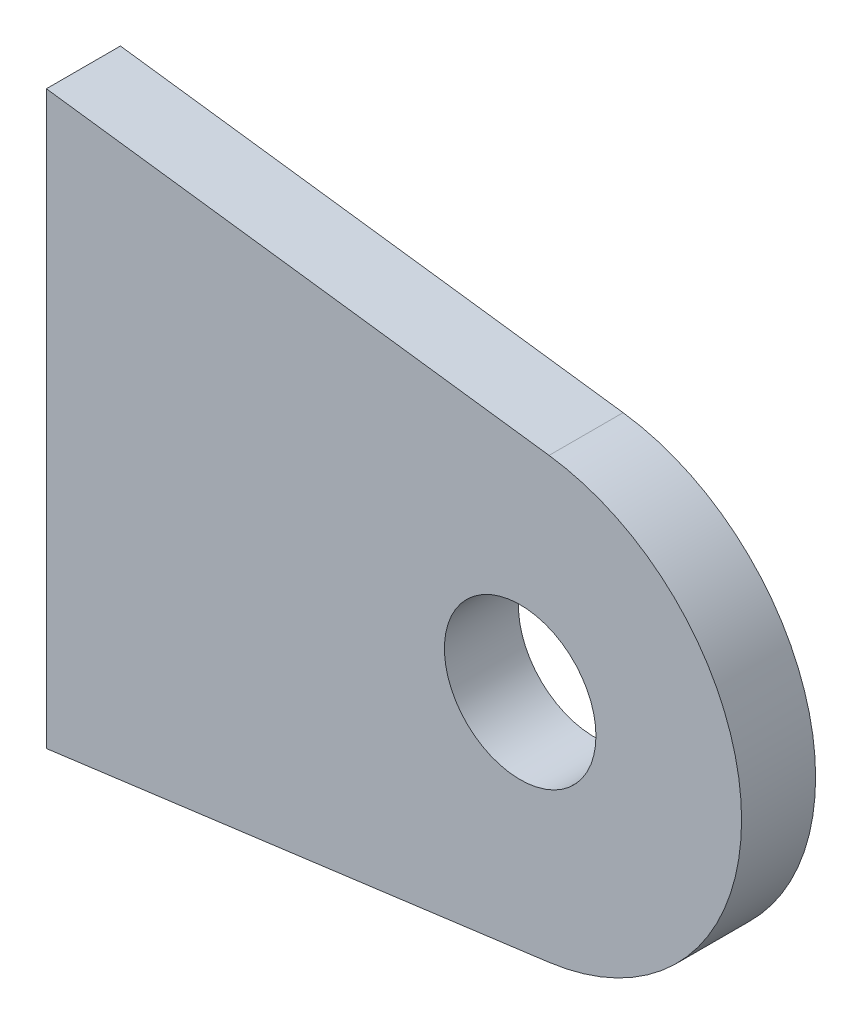
ISO-10303-21;
HEADER;
FILE_DESCRIPTION(('STEP AP214'),'2;1');
FILE_NAME('part.step','',(''),(''),'','','');
FILE_SCHEMA(('AUTOMOTIVE_DESIGN { 1 0 10303 214 1 1 1 1 }'));
ENDSEC;
DATA;
#1=APPLICATION_CONTEXT('core data for automotive mechanical design processes');
#2=APPLICATION_PROTOCOL_DEFINITION('international standard','automotive_design',2000,#1);
#3=PRODUCT_CONTEXT('',#1,'mechanical');
#4=PRODUCT('Part','Part','',(#3));
#5=PRODUCT_RELATED_PRODUCT_CATEGORY('part','',(#4));
#6=PRODUCT_DEFINITION_FORMATION('','',#4);
#7=PRODUCT_DEFINITION_CONTEXT('part definition',#1,'design');
#8=PRODUCT_DEFINITION('design','',#6,#7);
#9=PRODUCT_DEFINITION_SHAPE('','',#8);
#10=(LENGTH_UNIT() NAMED_UNIT(*) SI_UNIT(.MILLI.,.METRE.));
#11=(NAMED_UNIT(*) PLANE_ANGLE_UNIT() SI_UNIT($,.RADIAN.));
#12=(NAMED_UNIT(*) SI_UNIT($,.STERADIAN.) SOLID_ANGLE_UNIT());
#13=UNCERTAINTY_MEASURE_WITH_UNIT(LENGTH_MEASURE(1.E-05),#10,'distance_accuracy_value','');
#14=(GEOMETRIC_REPRESENTATION_CONTEXT(3) GLOBAL_UNCERTAINTY_ASSIGNED_CONTEXT((#13)) GLOBAL_UNIT_ASSIGNED_CONTEXT((#10,
#11,#12)) REPRESENTATION_CONTEXT('',''));
#15=CARTESIAN_POINT('',(0.,0.,0.));
#16=DIRECTION('',(0.,0.,1.));
#17=DIRECTION('',(1.,0.,0.));
#18=AXIS2_PLACEMENT_3D('',#15,#16,#17);
#19=CARTESIAN_POINT('',(1.23946787290707,-9.41469319322447,3.17499999999981));
#20=DIRECTION('',(0.130526192220053,-0.99144486137381,0.));
#21=DIRECTION('',(0.99144486137381,0.130526192220053,0.));
#22=AXIS2_PLACEMENT_3D('',#19,#20,#21);
#23=PLANE('',#22);
#24=DIRECTION('',(-0.99144486137381,-0.130526192220053,0.));
#25=VECTOR('',#24,1.);
#26=CARTESIAN_POINT('',(1.23946787290707,-9.41469319322447,-1.94289029309402E-13));
#27=LINE('',#26,#25);
#28=CARTESIAN_POINT('',(1.23946787290707,-9.41469319322442,-1.94289029309402E-13));
#29=VERTEX_POINT('',#28);
#30=CARTESIAN_POINT('',(-20.3199999999999,-12.2530509853479,-1.94289029309402E-13));
#31=VERTEX_POINT('',#30);
#32=EDGE_CURVE('E106',#29,#31,#27,.T.);
#33=ORIENTED_EDGE('',*,*,#32,.F.);
#34=DIRECTION('',(0.,0.,-1.));
#35=VECTOR('',#34,1.);
#36=CARTESIAN_POINT('',(1.23946787290707,-9.41469319322442,3.17499999999981));
#37=LINE('',#36,#35);
#38=CARTESIAN_POINT('',(1.23946787290707,-9.41469319322442,3.17499999999981));
#39=VERTEX_POINT('',#38);
#40=EDGE_CURVE('E11',#39,#29,#37,.T.);
#41=ORIENTED_EDGE('',*,*,#40,.F.);
#42=DIRECTION('',(-0.99144486137381,-0.130526192220053,0.));
#43=VECTOR('',#42,1.);
#44=CARTESIAN_POINT('',(1.23946787290707,-9.41469319322447,3.17499999999981));
#45=LINE('',#44,#43);
#46=CARTESIAN_POINT('',(-20.3199999999999,-12.2530509853479,3.17499999999981));
#47=VERTEX_POINT('',#46);
#48=EDGE_CURVE('E88',#39,#47,#45,.T.);
#49=ORIENTED_EDGE('',*,*,#48,.T.);
#50=DIRECTION('',(0.,0.,-1.));
#51=VECTOR('',#50,1.);
#52=CARTESIAN_POINT('',(-20.3199999999999,-12.2530509853479,3.17499999999981));
#53=LINE('',#52,#51);
#54=EDGE_CURVE('E55',#47,#31,#53,.T.);
#55=ORIENTED_EDGE('',*,*,#54,.T.);
#56=EDGE_LOOP('',(#33,#41,#49,#55));
#57=FACE_BOUND('',#56,.T.);
#58=ADVANCED_FACE('F39',(#57),#23,.T.);
#59=CARTESIAN_POINT('',(0.,0.,3.17499999999981));
#60=DIRECTION('',(0.,0.,-1.));
#61=DIRECTION('',(-1.,0.,0.));
#62=AXIS2_PLACEMENT_3D('',#59,#60,#61);
#63=CYLINDRICAL_SURFACE('',#62,9.49593220966295);
#64=CARTESIAN_POINT('',(0.,0.,-1.94289029309402E-13));
#65=DIRECTION('',(0.,0.,1.));
#66=DIRECTION('',(1.,0.,0.));
#67=AXIS2_PLACEMENT_3D('',#64,#65,#66);
#68=CIRCLE('',#67,9.49593220966295);
#69=CARTESIAN_POINT('',(1.23946787290707,9.41469319322442,-1.94289029309402E-13));
#70=VERTEX_POINT('',#69);
#71=EDGE_CURVE('E94',#29,#70,#68,.T.);
#72=ORIENTED_EDGE('',*,*,#71,.T.);
#73=DIRECTION('',(0.,0.,-1.));
#74=VECTOR('',#73,1.);
#75=CARTESIAN_POINT('',(1.23946787290707,9.41469319322442,3.17499999999981));
#76=LINE('',#75,#74);
#77=CARTESIAN_POINT('',(1.23946787290707,9.41469319322442,3.17499999999981));
#78=VERTEX_POINT('',#77);
#79=EDGE_CURVE('E47',#78,#70,#76,.T.);
#80=ORIENTED_EDGE('',*,*,#79,.F.);
#81=CARTESIAN_POINT('',(0.,0.,3.17499999999981));
#82=DIRECTION('',(0.,0.,1.));
#83=DIRECTION('',(1.,0.,0.));
#84=AXIS2_PLACEMENT_3D('',#81,#82,#83);
#85=CIRCLE('',#84,9.49593220966295);
#86=EDGE_CURVE('E81',#39,#78,#85,.T.);
#87=ORIENTED_EDGE('',*,*,#86,.F.);
#88=ORIENTED_EDGE('',*,*,#40,.T.);
#89=EDGE_LOOP('',(#72,#80,#87,#88));
#90=FACE_BOUND('',#89,.T.);
#91=ADVANCED_FACE('F92',(#90),#63,.T.);
#92=CARTESIAN_POINT('',(1.23946787290707,9.41469319322445,3.17499999999981));
#93=DIRECTION('',(-0.130526192220054,-0.99144486137381,0.));
#94=DIRECTION('',(0.99144486137381,-0.130526192220054,0.));
#95=AXIS2_PLACEMENT_3D('',#92,#93,#94);
#96=PLANE('',#95);
#97=DIRECTION('',(-0.99144486137381,0.130526192220054,0.));
#98=VECTOR('',#97,1.);
#99=CARTESIAN_POINT('',(1.23946787290707,9.41469319322445,-1.94289029309402E-13));
#100=LINE('',#99,#98);
#101=CARTESIAN_POINT('',(-20.3199999999999,12.2530509853479,-1.94289029309402E-13));
#102=VERTEX_POINT('',#101);
#103=EDGE_CURVE('E109',#70,#102,#100,.T.);
#104=ORIENTED_EDGE('',*,*,#103,.T.);
#105=DIRECTION('',(0.,0.,-1.));
#106=VECTOR('',#105,1.);
#107=CARTESIAN_POINT('',(-20.3199999999999,12.2530509853479,3.17499999999981));
#108=LINE('',#107,#106);
#109=CARTESIAN_POINT('',(-20.3199999999999,12.2530509853479,3.17499999999981));
#110=VERTEX_POINT('',#109);
#111=EDGE_CURVE('E69',#110,#102,#108,.T.);
#112=ORIENTED_EDGE('',*,*,#111,.F.);
#113=DIRECTION('',(-0.99144486137381,0.130526192220054,0.));
#114=VECTOR('',#113,1.);
#115=CARTESIAN_POINT('',(1.23946787290707,9.41469319322445,3.17499999999981));
#116=LINE('',#115,#114);
#117=EDGE_CURVE('E87',#78,#110,#116,.T.);
#118=ORIENTED_EDGE('',*,*,#117,.F.);
#119=ORIENTED_EDGE('',*,*,#79,.T.);
#120=EDGE_LOOP('',(#104,#112,#118,#119));
#121=FACE_BOUND('',#120,.T.);
#122=ADVANCED_FACE('F97',(#121),#96,.F.);
#123=CARTESIAN_POINT('',(-20.3199999999999,0.,3.17499999999981));
#124=DIRECTION('',(-1.,0.,0.));
#125=DIRECTION('',(0.,0.,1.));
#126=AXIS2_PLACEMENT_3D('',#123,#124,#125);
#127=PLANE('',#126);
#128=DIRECTION('',(0.,1.,0.));
#129=VECTOR('',#128,1.);
#130=CARTESIAN_POINT('',(-20.3199999999999,0.,-1.94289029309402E-13));
#131=LINE('',#130,#129);
#132=EDGE_CURVE('E111',#31,#102,#131,.T.);
#133=ORIENTED_EDGE('',*,*,#132,.F.);
#134=ORIENTED_EDGE('',*,*,#54,.F.);
#135=DIRECTION('',(0.,1.,0.));
#136=VECTOR('',#135,1.);
#137=CARTESIAN_POINT('',(-20.3199999999999,0.,3.17499999999981));
#138=LINE('',#137,#136);
#139=EDGE_CURVE('E98',#47,#110,#138,.T.);
#140=ORIENTED_EDGE('',*,*,#139,.T.);
#141=ORIENTED_EDGE('',*,*,#111,.T.);
#142=EDGE_LOOP('',(#133,#134,#140,#141));
#143=FACE_BOUND('',#142,.T.);
#144=ADVANCED_FACE('F120',(#143),#127,.T.);
#145=CARTESIAN_POINT('',(0.,0.,3.17499999999981));
#146=DIRECTION('',(0.,0.,-1.));
#147=DIRECTION('',(-1.,0.,0.));
#148=AXIS2_PLACEMENT_3D('',#145,#146,#147);
#149=CYLINDRICAL_SURFACE('',#148,3.24999999999995);
#150=CARTESIAN_POINT('',(0.,0.,3.17499999999981));
#151=DIRECTION('',(0.,0.,1.));
#152=DIRECTION('',(1.,0.,0.));
#153=AXIS2_PLACEMENT_3D('',#150,#151,#152);
#154=CIRCLE('',#153,3.24999999999995);
#155=CARTESIAN_POINT('',(3.24999999999995,0.,3.17499999999981));
#156=VERTEX_POINT('',#155);
#157=EDGE_CURVE('E100',#156,#156,#154,.T.);
#158=ORIENTED_EDGE('',*,*,#157,.T.);
#159=EDGE_LOOP('',(#158));
#160=FACE_BOUND('',#159,.T.);
#161=CARTESIAN_POINT('',(0.,0.,-1.94289029309402E-13));
#162=DIRECTION('',(0.,0.,1.));
#163=DIRECTION('',(1.,0.,0.));
#164=AXIS2_PLACEMENT_3D('',#161,#162,#163);
#165=CIRCLE('',#164,3.24999999999995);
#166=CARTESIAN_POINT('',(3.24999999999995,0.,-1.94289029309402E-13));
#167=VERTEX_POINT('',#166);
#168=EDGE_CURVE('E114',#167,#167,#165,.T.);
#169=ORIENTED_EDGE('',*,*,#168,.F.);
#170=EDGE_LOOP('',(#169));
#171=FACE_BOUND('',#170,.T.);
#172=ADVANCED_FACE('F122',(#160,#171),#149,.F.);
#173=CARTESIAN_POINT('',(0.,0.,3.17499999999981));
#174=DIRECTION('',(0.,0.,1.));
#175=DIRECTION('',(1.,0.,0.));
#176=AXIS2_PLACEMENT_3D('',#173,#174,#175);
#177=PLANE('',#176);
#178=ORIENTED_EDGE('',*,*,#48,.F.);
#179=ORIENTED_EDGE('',*,*,#86,.T.);
#180=ORIENTED_EDGE('',*,*,#117,.T.);
#181=ORIENTED_EDGE('',*,*,#139,.F.);
#182=EDGE_LOOP('',(#178,#179,#180,#181));
#183=FACE_BOUND('',#182,.T.);
#184=ORIENTED_EDGE('',*,*,#157,.F.);
#185=EDGE_LOOP('',(#184));
#186=FACE_BOUND('',#185,.T.);
#187=ADVANCED_FACE('F83',(#183,#186),#177,.T.);
#188=CARTESIAN_POINT('',(0.,0.,-1.94289029309402E-13));
#189=DIRECTION('',(0.,0.,1.));
#190=DIRECTION('',(1.,0.,0.));
#191=AXIS2_PLACEMENT_3D('',#188,#189,#190);
#192=PLANE('',#191);
#193=ORIENTED_EDGE('',*,*,#32,.T.);
#194=ORIENTED_EDGE('',*,*,#132,.T.);
#195=ORIENTED_EDGE('',*,*,#103,.F.);
#196=ORIENTED_EDGE('',*,*,#71,.F.);
#197=EDGE_LOOP('',(#193,#194,#195,#196));
#198=FACE_BOUND('',#197,.T.);
#199=ORIENTED_EDGE('',*,*,#168,.T.);
#200=EDGE_LOOP('',(#199));
#201=FACE_BOUND('',#200,.T.);
#202=ADVANCED_FACE('F161',(#198,#201),#192,.F.);
#203=CLOSED_SHELL('',(#58,#91,#122,#144,#172,#187,#202));
#204=MANIFOLD_SOLID_BREP('B2',#203);
#205=ADVANCED_BREP_SHAPE_REPRESENTATION('',(#18,#204),#14);
#206=SHAPE_DEFINITION_REPRESENTATION(#9,#205);
ENDSEC;
END-ISO-10303-21;
